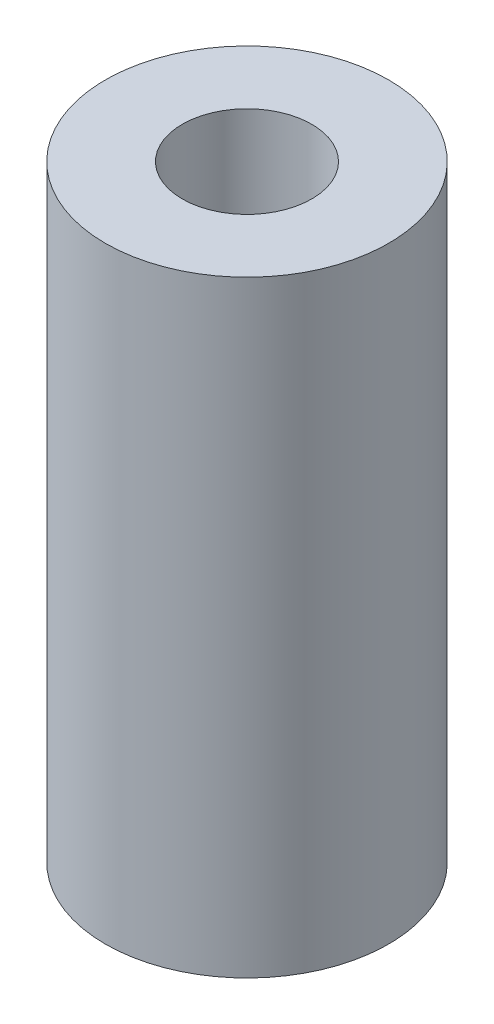
ISO-10303-21;
HEADER;
FILE_DESCRIPTION(('STEP AP214'),'2;1');
FILE_NAME('part.step','',(''),(''),'','','');
FILE_SCHEMA(('AUTOMOTIVE_DESIGN { 1 0 10303 214 1 1 1 1 }'));
ENDSEC;
DATA;
#1=APPLICATION_CONTEXT('core data for automotive mechanical design processes');
#2=APPLICATION_PROTOCOL_DEFINITION('international standard','automotive_design',2000,#1);
#3=PRODUCT_CONTEXT('',#1,'mechanical');
#4=PRODUCT('Part','Part','',(#3));
#5=PRODUCT_RELATED_PRODUCT_CATEGORY('part','',(#4));
#6=PRODUCT_DEFINITION_FORMATION('','',#4);
#7=PRODUCT_DEFINITION_CONTEXT('part definition',#1,'design');
#8=PRODUCT_DEFINITION('design','',#6,#7);
#9=PRODUCT_DEFINITION_SHAPE('','',#8);
#10=(LENGTH_UNIT() NAMED_UNIT(*) SI_UNIT(.MILLI.,.METRE.));
#11=(NAMED_UNIT(*) PLANE_ANGLE_UNIT() SI_UNIT($,.RADIAN.));
#12=(NAMED_UNIT(*) SI_UNIT($,.STERADIAN.) SOLID_ANGLE_UNIT());
#13=UNCERTAINTY_MEASURE_WITH_UNIT(LENGTH_MEASURE(1.E-05),#10,'distance_accuracy_value','');
#14=(GEOMETRIC_REPRESENTATION_CONTEXT(3) GLOBAL_UNCERTAINTY_ASSIGNED_CONTEXT((#13)) GLOBAL_UNIT_ASSIGNED_CONTEXT((#10,
#11,#12)) REPRESENTATION_CONTEXT('',''));
#15=CARTESIAN_POINT('',(0.,0.,0.));
#16=DIRECTION('',(0.,0.,1.));
#17=DIRECTION('',(1.,0.,0.));
#18=AXIS2_PLACEMENT_3D('',#15,#16,#17);
#19=CARTESIAN_POINT('',(0.,7.5,0.));
#20=DIRECTION('',(0.,1.,0.));
#21=DIRECTION('',(0.,0.,1.));
#22=AXIS2_PLACEMENT_3D('',#19,#20,#21);
#23=PLANE('',#22);
#24=CARTESIAN_POINT('',(0.,7.5,0.));
#25=DIRECTION('',(0.,1.,0.));
#26=DIRECTION('',(0.,0.,1.));
#27=AXIS2_PLACEMENT_3D('',#24,#25,#26);
#28=CIRCLE('',#27,3.5);
#29=CARTESIAN_POINT('',(0.,7.5,3.5));
#30=VERTEX_POINT('',#29);
#31=EDGE_CURVE('E10',#30,#30,#28,.T.);
#32=ORIENTED_EDGE('',*,*,#31,.T.);
#33=EDGE_LOOP('',(#32));
#34=FACE_BOUND('',#33,.T.);
#35=CARTESIAN_POINT('',(0.,7.5,0.));
#36=DIRECTION('',(0.,1.,0.));
#37=DIRECTION('',(0.,0.,1.));
#38=AXIS2_PLACEMENT_3D('',#35,#36,#37);
#39=CIRCLE('',#38,1.6);
#40=CARTESIAN_POINT('',(0.,7.5,1.6));
#41=VERTEX_POINT('',#40);
#42=EDGE_CURVE('E44',#41,#41,#39,.T.);
#43=ORIENTED_EDGE('',*,*,#42,.F.);
#44=EDGE_LOOP('',(#43));
#45=FACE_BOUND('',#44,.T.);
#46=ADVANCED_FACE('F33',(#34,#45),#23,.T.);
#47=CARTESIAN_POINT('',(0.,-7.5,0.));
#48=DIRECTION('',(0.,1.,0.));
#49=DIRECTION('',(0.,0.,1.));
#50=AXIS2_PLACEMENT_3D('',#47,#48,#49);
#51=PLANE('',#50);
#52=CARTESIAN_POINT('',(0.,-7.5,0.));
#53=DIRECTION('',(0.,1.,0.));
#54=DIRECTION('',(0.,0.,1.));
#55=AXIS2_PLACEMENT_3D('',#52,#53,#54);
#56=CIRCLE('',#55,3.5);
#57=CARTESIAN_POINT('',(0.,-7.5,3.5));
#58=VERTEX_POINT('',#57);
#59=EDGE_CURVE('E37',#58,#58,#56,.T.);
#60=ORIENTED_EDGE('',*,*,#59,.F.);
#61=EDGE_LOOP('',(#60));
#62=FACE_BOUND('',#61,.T.);
#63=CARTESIAN_POINT('',(0.,-7.5,0.));
#64=DIRECTION('',(0.,1.,0.));
#65=DIRECTION('',(0.,0.,1.));
#66=AXIS2_PLACEMENT_3D('',#63,#64,#65);
#67=CIRCLE('',#66,1.6);
#68=CARTESIAN_POINT('',(0.,-7.5,1.6));
#69=VERTEX_POINT('',#68);
#70=EDGE_CURVE('E46',#69,#69,#67,.T.);
#71=ORIENTED_EDGE('',*,*,#70,.T.);
#72=EDGE_LOOP('',(#71));
#73=FACE_BOUND('',#72,.T.);
#74=ADVANCED_FACE('F56',(#62,#73),#51,.F.);
#75=CARTESIAN_POINT('',(0.,7.5,0.));
#76=DIRECTION('',(0.,-1.,0.));
#77=DIRECTION('',(0.,0.,-1.));
#78=AXIS2_PLACEMENT_3D('',#75,#76,#77);
#79=CYLINDRICAL_SURFACE('',#78,3.5);
#80=ORIENTED_EDGE('',*,*,#31,.F.);
#81=EDGE_LOOP('',(#80));
#82=FACE_BOUND('',#81,.T.);
#83=ORIENTED_EDGE('',*,*,#59,.T.);
#84=EDGE_LOOP('',(#83));
#85=FACE_BOUND('',#84,.T.);
#86=ADVANCED_FACE('F35',(#82,#85),#79,.T.);
#87=CARTESIAN_POINT('',(0.,7.5,0.));
#88=DIRECTION('',(0.,-1.,0.));
#89=DIRECTION('',(0.,0.,-1.));
#90=AXIS2_PLACEMENT_3D('',#87,#88,#89);
#91=CYLINDRICAL_SURFACE('',#90,1.6);
#92=ORIENTED_EDGE('',*,*,#42,.T.);
#93=EDGE_LOOP('',(#92));
#94=FACE_BOUND('',#93,.T.);
#95=ORIENTED_EDGE('',*,*,#70,.F.);
#96=EDGE_LOOP('',(#95));
#97=FACE_BOUND('',#96,.T.);
#98=ADVANCED_FACE('F52',(#94,#97),#91,.F.);
#99=CLOSED_SHELL('',(#46,#74,#86,#98));
#100=MANIFOLD_SOLID_BREP('B2',#99);
#101=ADVANCED_BREP_SHAPE_REPRESENTATION('',(#18,#100),#14);
#102=SHAPE_DEFINITION_REPRESENTATION(#9,#101);
ENDSEC;
END-ISO-10303-21;
